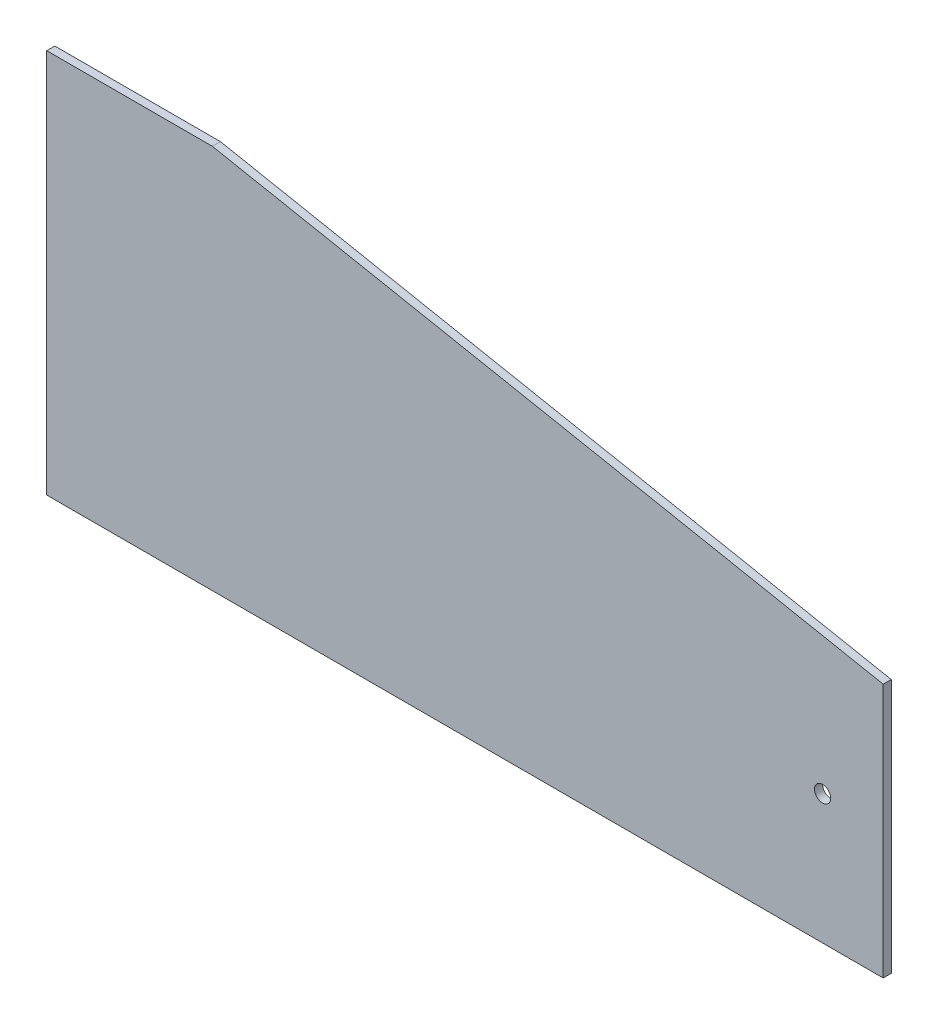
ISO-10303-21;
HEADER;
FILE_DESCRIPTION(('STEP AP214'),'2;1');
FILE_NAME('part.step','',(''),(''),'','','');
FILE_SCHEMA(('AUTOMOTIVE_DESIGN { 1 0 10303 214 1 1 1 1 }'));
ENDSEC;
DATA;
#1=APPLICATION_CONTEXT('core data for automotive mechanical design processes');
#2=APPLICATION_PROTOCOL_DEFINITION('international standard','automotive_design',2000,#1);
#3=PRODUCT_CONTEXT('',#1,'mechanical');
#4=PRODUCT('Part','Part','',(#3));
#5=PRODUCT_RELATED_PRODUCT_CATEGORY('part','',(#4));
#6=PRODUCT_DEFINITION_FORMATION('','',#4);
#7=PRODUCT_DEFINITION_CONTEXT('part definition',#1,'design');
#8=PRODUCT_DEFINITION('design','',#6,#7);
#9=PRODUCT_DEFINITION_SHAPE('','',#8);
#10=(LENGTH_UNIT() NAMED_UNIT(*) SI_UNIT(.MILLI.,.METRE.));
#11=(NAMED_UNIT(*) PLANE_ANGLE_UNIT() SI_UNIT($,.RADIAN.));
#12=(NAMED_UNIT(*) SI_UNIT($,.STERADIAN.) SOLID_ANGLE_UNIT());
#13=UNCERTAINTY_MEASURE_WITH_UNIT(LENGTH_MEASURE(1.E-05),#10,'distance_accuracy_value','');
#14=(GEOMETRIC_REPRESENTATION_CONTEXT(3) GLOBAL_UNCERTAINTY_ASSIGNED_CONTEXT((#13)) GLOBAL_UNIT_ASSIGNED_CONTEXT((#10,
#11,#12)) REPRESENTATION_CONTEXT('',''));
#15=CARTESIAN_POINT('',(0.,0.,0.));
#16=DIRECTION('',(0.,0.,1.));
#17=DIRECTION('',(1.,0.,0.));
#18=AXIS2_PLACEMENT_3D('',#15,#16,#17);
#19=CARTESIAN_POINT('',(1315.,4.91338006875447E-12,12.7));
#20=DIRECTION('',(0.,1.,0.));
#21=DIRECTION('',(-1.,0.,0.));
#22=AXIS2_PLACEMENT_3D('',#19,#20,#21);
#23=PLANE('',#22);
#24=DIRECTION('',(1.,0.,0.));
#25=VECTOR('',#24,1.);
#26=CARTESIAN_POINT('',(1315.,4.91338006875447E-12,0.));
#27=LINE('',#26,#25);
#28=CARTESIAN_POINT('',(0.,0.,0.));
#29=VERTEX_POINT('',#28);
#30=CARTESIAN_POINT('',(1315.,4.91338006875447E-12,0.));
#31=VERTEX_POINT('',#30);
#32=EDGE_CURVE('E117',#29,#31,#27,.T.);
#33=ORIENTED_EDGE('',*,*,#32,.T.);
#34=DIRECTION('',(0.,0.,-1.));
#35=VECTOR('',#34,1.);
#36=CARTESIAN_POINT('',(1315.,4.91338006875447E-12,12.7));
#37=LINE('',#36,#35);
#38=CARTESIAN_POINT('',(1315.,4.91338006875447E-12,12.7));
#39=VERTEX_POINT('',#38);
#40=EDGE_CURVE('E11',#39,#31,#37,.T.);
#41=ORIENTED_EDGE('',*,*,#40,.F.);
#42=DIRECTION('',(1.,0.,0.));
#43=VECTOR('',#42,1.);
#44=CARTESIAN_POINT('',(1315.,4.91338006875447E-12,12.7));
#45=LINE('',#44,#43);
#46=CARTESIAN_POINT('',(0.,0.,12.7));
#47=VERTEX_POINT('',#46);
#48=EDGE_CURVE('E131',#47,#39,#45,.T.);
#49=ORIENTED_EDGE('',*,*,#48,.F.);
#50=DIRECTION('',(0.,0.,-1.));
#51=VECTOR('',#50,1.);
#52=CARTESIAN_POINT('',(0.,0.,12.7));
#53=LINE('',#52,#51);
#54=EDGE_CURVE('E113',#47,#29,#53,.T.);
#55=ORIENTED_EDGE('',*,*,#54,.T.);
#56=EDGE_LOOP('',(#33,#41,#49,#55));
#57=FACE_BOUND('',#56,.T.);
#58=ADVANCED_FACE('F38',(#57),#23,.F.);
#59=CARTESIAN_POINT('',(1315.,400.000000000005,12.7));
#60=DIRECTION('',(-1.,0.,0.));
#61=DIRECTION('',(0.,0.,1.));
#62=AXIS2_PLACEMENT_3D('',#59,#60,#61);
#63=PLANE('',#62);
#64=DIRECTION('',(0.,1.,0.));
#65=VECTOR('',#64,1.);
#66=CARTESIAN_POINT('',(1315.,400.000000000005,0.));
#67=LINE('',#66,#65);
#68=CARTESIAN_POINT('',(1315.,400.000000000005,0.));
#69=VERTEX_POINT('',#68);
#70=EDGE_CURVE('E121',#31,#69,#67,.T.);
#71=ORIENTED_EDGE('',*,*,#70,.T.);
#72=DIRECTION('',(0.,0.,-1.));
#73=VECTOR('',#72,1.);
#74=CARTESIAN_POINT('',(1315.,400.000000000005,12.7));
#75=LINE('',#74,#73);
#76=CARTESIAN_POINT('',(1315.,400.000000000005,12.7));
#77=VERTEX_POINT('',#76);
#78=EDGE_CURVE('E47',#77,#69,#75,.T.);
#79=ORIENTED_EDGE('',*,*,#78,.F.);
#80=DIRECTION('',(0.,1.,0.));
#81=VECTOR('',#80,1.);
#82=CARTESIAN_POINT('',(1315.,400.000000000005,12.7));
#83=LINE('',#82,#81);
#84=EDGE_CURVE('E89',#39,#77,#83,.T.);
#85=ORIENTED_EDGE('',*,*,#84,.F.);
#86=ORIENTED_EDGE('',*,*,#40,.T.);
#87=EDGE_LOOP('',(#71,#79,#85,#86));
#88=FACE_BOUND('',#87,.T.);
#89=ADVANCED_FACE('F155',(#88),#63,.F.);
#90=CARTESIAN_POINT('',(260.366426726098,604.999999999999,12.7));
#91=DIRECTION('',(-0.190808995376542,-0.981627183447665,0.));
#92=DIRECTION('',(0.981627183447665,-0.190808995376542,0.));
#93=AXIS2_PLACEMENT_3D('',#90,#91,#92);
#94=PLANE('',#93);
#95=DIRECTION('',(-0.981627183447665,0.190808995376542,0.));
#96=VECTOR('',#95,1.);
#97=CARTESIAN_POINT('',(260.366426726098,604.999999999999,0.));
#98=LINE('',#97,#96);
#99=CARTESIAN_POINT('',(260.366426726098,604.999999999999,0.));
#100=VERTEX_POINT('',#99);
#101=EDGE_CURVE('E105',#69,#100,#98,.T.);
#102=ORIENTED_EDGE('',*,*,#101,.T.);
#103=DIRECTION('',(0.,0.,-1.));
#104=VECTOR('',#103,1.);
#105=CARTESIAN_POINT('',(260.366426726098,604.999999999999,12.7));
#106=LINE('',#105,#104);
#107=CARTESIAN_POINT('',(260.366426726098,604.999999999999,12.7));
#108=VERTEX_POINT('',#107);
#109=EDGE_CURVE('E102',#108,#100,#106,.T.);
#110=ORIENTED_EDGE('',*,*,#109,.F.);
#111=DIRECTION('',(-0.981627183447665,0.190808995376542,0.));
#112=VECTOR('',#111,1.);
#113=CARTESIAN_POINT('',(260.366426726098,604.999999999999,12.7));
#114=LINE('',#113,#112);
#115=EDGE_CURVE('E93',#77,#108,#114,.T.);
#116=ORIENTED_EDGE('',*,*,#115,.F.);
#117=ORIENTED_EDGE('',*,*,#78,.T.);
#118=EDGE_LOOP('',(#102,#110,#116,#117));
#119=FACE_BOUND('',#118,.T.);
#120=ADVANCED_FACE('F103',(#119),#94,.F.);
#121=CARTESIAN_POINT('',(0.,605.,12.7));
#122=DIRECTION('',(0.,-1.,0.));
#123=DIRECTION('',(1.,0.,0.));
#124=AXIS2_PLACEMENT_3D('',#121,#122,#123);
#125=PLANE('',#124);
#126=DIRECTION('',(-1.,0.,0.));
#127=VECTOR('',#126,1.);
#128=CARTESIAN_POINT('',(0.,605.,0.));
#129=LINE('',#128,#127);
#130=CARTESIAN_POINT('',(0.,605.,0.));
#131=VERTEX_POINT('',#130);
#132=EDGE_CURVE('E75',#100,#131,#129,.T.);
#133=ORIENTED_EDGE('',*,*,#132,.T.);
#134=DIRECTION('',(0.,0.,-1.));
#135=VECTOR('',#134,1.);
#136=CARTESIAN_POINT('',(0.,605.,12.7));
#137=LINE('',#136,#135);
#138=CARTESIAN_POINT('',(0.,605.,12.7));
#139=VERTEX_POINT('',#138);
#140=EDGE_CURVE('E107',#139,#131,#137,.T.);
#141=ORIENTED_EDGE('',*,*,#140,.F.);
#142=DIRECTION('',(-1.,0.,0.));
#143=VECTOR('',#142,1.);
#144=CARTESIAN_POINT('',(0.,605.,12.7));
#145=LINE('',#144,#143);
#146=EDGE_CURVE('E97',#108,#139,#145,.T.);
#147=ORIENTED_EDGE('',*,*,#146,.F.);
#148=ORIENTED_EDGE('',*,*,#109,.T.);
#149=EDGE_LOOP('',(#133,#141,#147,#148));
#150=FACE_BOUND('',#149,.T.);
#151=ADVANCED_FACE('F109',(#150),#125,.F.);
#152=CARTESIAN_POINT('',(0.,0.,12.7));
#153=DIRECTION('',(1.,0.,0.));
#154=DIRECTION('',(0.,0.,-1.));
#155=AXIS2_PLACEMENT_3D('',#152,#153,#154);
#156=PLANE('',#155);
#157=DIRECTION('',(0.,-1.,0.));
#158=VECTOR('',#157,1.);
#159=CARTESIAN_POINT('',(0.,0.,0.));
#160=LINE('',#159,#158);
#161=EDGE_CURVE('E81',#131,#29,#160,.T.);
#162=ORIENTED_EDGE('',*,*,#161,.T.);
#163=ORIENTED_EDGE('',*,*,#54,.F.);
#164=DIRECTION('',(0.,-1.,0.));
#165=VECTOR('',#164,1.);
#166=CARTESIAN_POINT('',(0.,0.,12.7));
#167=LINE('',#166,#165);
#168=EDGE_CURVE('E55',#139,#47,#167,.T.);
#169=ORIENTED_EDGE('',*,*,#168,.F.);
#170=ORIENTED_EDGE('',*,*,#140,.T.);
#171=EDGE_LOOP('',(#162,#163,#169,#170));
#172=FACE_BOUND('',#171,.T.);
#173=ADVANCED_FACE('F142',(#172),#156,.F.);
#174=CARTESIAN_POINT('',(0.,0.,12.7));
#175=DIRECTION('',(0.,0.,-1.));
#176=DIRECTION('',(-1.,0.,0.));
#177=AXIS2_PLACEMENT_3D('',#174,#175,#176);
#178=PLANE('',#177);
#179=CARTESIAN_POINT('',(1219.75,203.2,12.7));
#180=DIRECTION('',(0.,0.,-1.));
#181=DIRECTION('',(-1.,0.,0.));
#182=AXIS2_PLACEMENT_3D('',#179,#180,#181);
#183=CIRCLE('',#182,12.6999999999999);
#184=CARTESIAN_POINT('',(1207.05,203.2,12.7));
#185=VERTEX_POINT('',#184);
#186=EDGE_CURVE('E122',#185,#185,#183,.T.);
#187=ORIENTED_EDGE('',*,*,#186,.T.);
#188=EDGE_LOOP('',(#187));
#189=FACE_BOUND('',#188,.T.);
#190=ORIENTED_EDGE('',*,*,#48,.T.);
#191=ORIENTED_EDGE('',*,*,#84,.T.);
#192=ORIENTED_EDGE('',*,*,#115,.T.);
#193=ORIENTED_EDGE('',*,*,#146,.T.);
#194=ORIENTED_EDGE('',*,*,#168,.T.);
#195=EDGE_LOOP('',(#190,#191,#192,#193,#194));
#196=FACE_BOUND('',#195,.T.);
#197=ADVANCED_FACE('F95',(#189,#196),#178,.F.);
#198=CARTESIAN_POINT('',(0.,0.,0.));
#199=DIRECTION('',(0.,0.,-1.));
#200=DIRECTION('',(-1.,0.,0.));
#201=AXIS2_PLACEMENT_3D('',#198,#199,#200);
#202=PLANE('',#201);
#203=CARTESIAN_POINT('',(1219.75,203.2,0.));
#204=DIRECTION('',(0.,0.,-1.));
#205=DIRECTION('',(-1.,0.,0.));
#206=AXIS2_PLACEMENT_3D('',#203,#204,#205);
#207=CIRCLE('',#206,12.6999999999999);
#208=CARTESIAN_POINT('',(1207.05,203.2,0.));
#209=VERTEX_POINT('',#208);
#210=EDGE_CURVE('E203',#209,#209,#207,.T.);
#211=ORIENTED_EDGE('',*,*,#210,.F.);
#212=EDGE_LOOP('',(#211));
#213=FACE_BOUND('',#212,.T.);
#214=ORIENTED_EDGE('',*,*,#32,.F.);
#215=ORIENTED_EDGE('',*,*,#161,.F.);
#216=ORIENTED_EDGE('',*,*,#132,.F.);
#217=ORIENTED_EDGE('',*,*,#101,.F.);
#218=ORIENTED_EDGE('',*,*,#70,.F.);
#219=EDGE_LOOP('',(#214,#215,#216,#217,#218));
#220=FACE_BOUND('',#219,.T.);
#221=ADVANCED_FACE('F138',(#213,#220),#202,.T.);
#222=CARTESIAN_POINT('',(1219.75,203.2,203.2));
#223=DIRECTION('',(0.,0.,-1.));
#224=DIRECTION('',(-1.,0.,0.));
#225=AXIS2_PLACEMENT_3D('',#222,#223,#224);
#226=CYLINDRICAL_SURFACE('',#225,12.6999999999999);
#227=ORIENTED_EDGE('',*,*,#210,.T.);
#228=EDGE_LOOP('',(#227));
#229=FACE_BOUND('',#228,.T.);
#230=ORIENTED_EDGE('',*,*,#186,.F.);
#231=EDGE_LOOP('',(#230));
#232=FACE_BOUND('',#231,.T.);
#233=ADVANCED_FACE('F184',(#229,#232),#226,.F.);
#234=CLOSED_SHELL('',(#58,#89,#120,#151,#173,#197,#221,#233));
#235=MANIFOLD_SOLID_BREP('B2',#234);
#236=ADVANCED_BREP_SHAPE_REPRESENTATION('',(#18,#235),#14);
#237=SHAPE_DEFINITION_REPRESENTATION(#9,#236);
ENDSEC;
END-ISO-10303-21;
